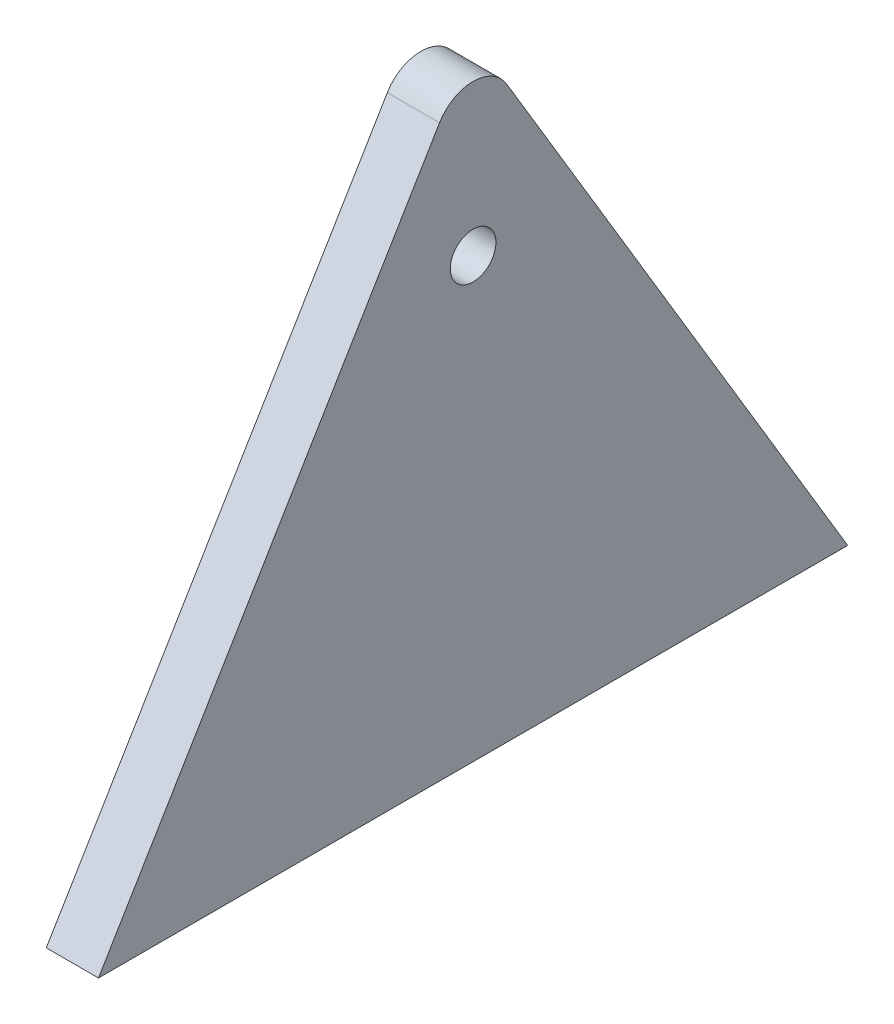
ISO-10303-21;
HEADER;
FILE_DESCRIPTION(('STEP AP214'),'2;1');
FILE_NAME('part.step','',(''),(''),'','','');
FILE_SCHEMA(('AUTOMOTIVE_DESIGN { 1 0 10303 214 1 1 1 1 }'));
ENDSEC;
DATA;
#1=APPLICATION_CONTEXT('core data for automotive mechanical design processes');
#2=APPLICATION_PROTOCOL_DEFINITION('international standard','automotive_design',2000,#1);
#3=PRODUCT_CONTEXT('',#1,'mechanical');
#4=PRODUCT('Part','Part','',(#3));
#5=PRODUCT_RELATED_PRODUCT_CATEGORY('part','',(#4));
#6=PRODUCT_DEFINITION_FORMATION('','',#4);
#7=PRODUCT_DEFINITION_CONTEXT('part definition',#1,'design');
#8=PRODUCT_DEFINITION('design','',#6,#7);
#9=PRODUCT_DEFINITION_SHAPE('','',#8);
#10=(LENGTH_UNIT() NAMED_UNIT(*) SI_UNIT(.MILLI.,.METRE.));
#11=(NAMED_UNIT(*) PLANE_ANGLE_UNIT() SI_UNIT($,.RADIAN.));
#12=(NAMED_UNIT(*) SI_UNIT($,.STERADIAN.) SOLID_ANGLE_UNIT());
#13=UNCERTAINTY_MEASURE_WITH_UNIT(LENGTH_MEASURE(1.E-05),#10,'distance_accuracy_value','');
#14=(GEOMETRIC_REPRESENTATION_CONTEXT(3) GLOBAL_UNCERTAINTY_ASSIGNED_CONTEXT((#13)) GLOBAL_UNIT_ASSIGNED_CONTEXT((#10,
#11,#12)) REPRESENTATION_CONTEXT('',''));
#15=CARTESIAN_POINT('',(0.,0.,0.));
#16=DIRECTION('',(0.,0.,1.));
#17=DIRECTION('',(1.,0.,0.));
#18=AXIS2_PLACEMENT_3D('',#15,#16,#17);
#19=CARTESIAN_POINT('',(12.7,152.4,0.));
#20=DIRECTION('',(0.,-0.513339087994548,0.858185866078512));
#21=DIRECTION('',(0.,-0.858185866078512,-0.513339087994548));
#22=AXIS2_PLACEMENT_3D('',#19,#20,#21);
#23=PLANE('',#22);
#24=DIRECTION('',(0.,0.858185866078512,0.513339087994548));
#25=VECTOR('',#24,1.);
#26=CARTESIAN_POINT('',(0.,152.4,0.));
#27=LINE('',#26,#25);
#28=CARTESIAN_POINT('',(0.,0.,-91.1607614418716));
#29=VERTEX_POINT('',#28);
#30=CARTESIAN_POINT('',(0.,138.734568016387,-8.17422037439783));
#31=VERTEX_POINT('',#30);
#32=EDGE_CURVE('E103',#29,#31,#27,.T.);
#33=ORIENTED_EDGE('',*,*,#32,.T.);
#34=DIRECTION('',(-1.,0.,0.));
#35=VECTOR('',#34,1.);
#36=CARTESIAN_POINT('',(12.7,138.734568016387,-8.17422037439782));
#37=LINE('',#36,#35);
#38=CARTESIAN_POINT('',(12.7,138.734568016387,-8.17422037439783));
#39=VERTEX_POINT('',#38);
#40=EDGE_CURVE('E44',#31,#39,#37,.F.);
#41=ORIENTED_EDGE('',*,*,#40,.T.);
#42=DIRECTION('',(0.,0.858185866078512,0.513339087994548));
#43=VECTOR('',#42,1.);
#44=CARTESIAN_POINT('',(12.7,152.4,0.));
#45=LINE('',#44,#43);
#46=CARTESIAN_POINT('',(12.7,0.,-91.1607614418716));
#47=VERTEX_POINT('',#46);
#48=EDGE_CURVE('E86',#47,#39,#45,.T.);
#49=ORIENTED_EDGE('',*,*,#48,.F.);
#50=DIRECTION('',(-1.,0.,0.));
#51=VECTOR('',#50,1.);
#52=CARTESIAN_POINT('',(12.7,0.,-91.1607614418716));
#53=LINE('',#52,#51);
#54=EDGE_CURVE('E95',#47,#29,#53,.T.);
#55=ORIENTED_EDGE('',*,*,#54,.T.);
#56=EDGE_LOOP('',(#33,#41,#49,#55));
#57=FACE_BOUND('',#56,.T.);
#58=ADVANCED_FACE('F35',(#57),#23,.F.);
#59=CARTESIAN_POINT('',(12.7,152.4,0.));
#60=DIRECTION('',(0.,-0.513339087994548,-0.858185866078512));
#61=DIRECTION('',(0.,0.858185866078512,-0.513339087994548));
#62=AXIS2_PLACEMENT_3D('',#59,#60,#61);
#63=PLANE('',#62);
#64=DIRECTION('',(0.,-0.858185866078512,0.513339087994548));
#65=VECTOR('',#64,1.);
#66=CARTESIAN_POINT('',(12.7,152.4,0.));
#67=LINE('',#66,#65);
#68=CARTESIAN_POINT('',(12.7,138.734568016387,8.17422037439783));
#69=VERTEX_POINT('',#68);
#70=CARTESIAN_POINT('',(12.7,0.,91.1607614418716));
#71=VERTEX_POINT('',#70);
#72=EDGE_CURVE('E76',#69,#71,#67,.T.);
#73=ORIENTED_EDGE('',*,*,#72,.F.);
#74=DIRECTION('',(-1.,0.,0.));
#75=VECTOR('',#74,1.);
#76=CARTESIAN_POINT('',(12.7,138.734568016387,8.17422037439782));
#77=LINE('',#76,#75);
#78=CARTESIAN_POINT('',(0.,138.734568016387,8.17422037439783));
#79=VERTEX_POINT('',#78);
#80=EDGE_CURVE('E94',#69,#79,#77,.T.);
#81=ORIENTED_EDGE('',*,*,#80,.T.);
#82=DIRECTION('',(0.,-0.858185866078512,0.513339087994548));
#83=VECTOR('',#82,1.);
#84=CARTESIAN_POINT('',(0.,152.4,0.));
#85=LINE('',#84,#83);
#86=CARTESIAN_POINT('',(0.,0.,91.1607614418716));
#87=VERTEX_POINT('',#86);
#88=EDGE_CURVE('E91',#79,#87,#85,.T.);
#89=ORIENTED_EDGE('',*,*,#88,.T.);
#90=DIRECTION('',(-1.,0.,0.));
#91=VECTOR('',#90,1.);
#92=CARTESIAN_POINT('',(12.7,0.,91.1607614418716));
#93=LINE('',#92,#91);
#94=EDGE_CURVE('E89',#71,#87,#93,.T.);
#95=ORIENTED_EDGE('',*,*,#94,.F.);
#96=EDGE_LOOP('',(#73,#81,#89,#95));
#97=FACE_BOUND('',#96,.T.);
#98=ADVANCED_FACE('F90',(#97),#63,.F.);
#99=CARTESIAN_POINT('',(12.7,0.,91.1607614418716));
#100=DIRECTION('',(0.,1.,0.));
#101=DIRECTION('',(0.,0.,1.));
#102=AXIS2_PLACEMENT_3D('',#99,#100,#101);
#103=PLANE('',#102);
#104=DIRECTION('',(0.,0.,-1.));
#105=VECTOR('',#104,1.);
#106=CARTESIAN_POINT('',(0.,0.,91.1607614418716));
#107=LINE('',#106,#105);
#108=EDGE_CURVE('E106',#87,#29,#107,.T.);
#109=ORIENTED_EDGE('',*,*,#108,.T.);
#110=ORIENTED_EDGE('',*,*,#54,.F.);
#111=DIRECTION('',(0.,0.,-1.));
#112=VECTOR('',#111,1.);
#113=CARTESIAN_POINT('',(12.7,0.,91.1607614418716));
#114=LINE('',#113,#112);
#115=EDGE_CURVE('E80',#71,#47,#114,.T.);
#116=ORIENTED_EDGE('',*,*,#115,.F.);
#117=ORIENTED_EDGE('',*,*,#94,.T.);
#118=EDGE_LOOP('',(#109,#110,#116,#117));
#119=FACE_BOUND('',#118,.T.);
#120=ADVANCED_FACE('F97',(#119),#103,.F.);
#121=CARTESIAN_POINT('',(12.7,0.,0.));
#122=DIRECTION('',(-1.,0.,0.));
#123=DIRECTION('',(0.,0.,1.));
#124=AXIS2_PLACEMENT_3D('',#121,#122,#123);
#125=PLANE('',#124);
#126=CARTESIAN_POINT('',(12.7,106.68,0.));
#127=DIRECTION('',(1.,0.,0.));
#128=DIRECTION('',(0.,0.,-1.));
#129=AXIS2_PLACEMENT_3D('',#126,#127,#128);
#130=CIRCLE('',#129,5.55625);
#131=CARTESIAN_POINT('',(12.7,106.68,-5.55625));
#132=VERTEX_POINT('',#131);
#133=EDGE_CURVE('E113',#132,#132,#130,.T.);
#134=ORIENTED_EDGE('',*,*,#133,.F.);
#135=EDGE_LOOP('',(#134));
#136=FACE_BOUND('',#135,.T.);
#137=ORIENTED_EDGE('',*,*,#48,.T.);
#138=CARTESIAN_POINT('',(12.7,133.845013203239,0.));
#139=DIRECTION('',(-1.,0.,0.));
#140=DIRECTION('',(0.,0.,1.));
#141=AXIS2_PLACEMENT_3D('',#138,#139,#140);
#142=CIRCLE('',#141,9.525);
#143=EDGE_CURVE('E11',#39,#69,#142,.F.);
#144=ORIENTED_EDGE('',*,*,#143,.T.);
#145=ORIENTED_EDGE('',*,*,#72,.T.);
#146=ORIENTED_EDGE('',*,*,#115,.T.);
#147=EDGE_LOOP('',(#137,#144,#145,#146));
#148=FACE_BOUND('',#147,.T.);
#149=ADVANCED_FACE('F78',(#136,#148),#125,.F.);
#150=CARTESIAN_POINT('',(0.,0.,0.));
#151=DIRECTION('',(-1.,0.,0.));
#152=DIRECTION('',(0.,0.,1.));
#153=AXIS2_PLACEMENT_3D('',#150,#151,#152);
#154=PLANE('',#153);
#155=CARTESIAN_POINT('',(0.,106.68,0.));
#156=DIRECTION('',(-1.,0.,0.));
#157=DIRECTION('',(0.,0.,1.));
#158=AXIS2_PLACEMENT_3D('',#155,#156,#157);
#159=CIRCLE('',#158,5.55625);
#160=CARTESIAN_POINT('',(0.,106.68,-5.55625));
#161=VERTEX_POINT('',#160);
#162=EDGE_CURVE('E39',#161,#161,#159,.T.);
#163=ORIENTED_EDGE('',*,*,#162,.F.);
#164=EDGE_LOOP('',(#163));
#165=FACE_BOUND('',#164,.T.);
#166=ORIENTED_EDGE('',*,*,#88,.F.);
#167=CARTESIAN_POINT('',(0.,133.845013203239,0.));
#168=DIRECTION('',(-1.,0.,0.));
#169=DIRECTION('',(0.,0.,1.));
#170=AXIS2_PLACEMENT_3D('',#167,#168,#169);
#171=CIRCLE('',#170,9.525);
#172=EDGE_CURVE('E58',#79,#31,#171,.T.);
#173=ORIENTED_EDGE('',*,*,#172,.T.);
#174=ORIENTED_EDGE('',*,*,#32,.F.);
#175=ORIENTED_EDGE('',*,*,#108,.F.);
#176=EDGE_LOOP('',(#166,#173,#174,#175));
#177=FACE_BOUND('',#176,.T.);
#178=ADVANCED_FACE('F111',(#165,#177),#154,.T.);
#179=CARTESIAN_POINT('',(12.7,133.845013203239,0.));
#180=DIRECTION('',(-1.,0.,0.));
#181=DIRECTION('',(0.,0.,1.));
#182=AXIS2_PLACEMENT_3D('',#179,#180,#181);
#183=CYLINDRICAL_SURFACE('',#182,9.525);
#184=ORIENTED_EDGE('',*,*,#143,.F.);
#185=ORIENTED_EDGE('',*,*,#40,.F.);
#186=ORIENTED_EDGE('',*,*,#172,.F.);
#187=ORIENTED_EDGE('',*,*,#80,.F.);
#188=EDGE_LOOP('',(#184,#185,#186,#187));
#189=FACE_BOUND('',#188,.T.);
#190=ADVANCED_FACE('F37',(#189),#183,.T.);
#191=CARTESIAN_POINT('',(-1.2E-05,106.68,0.));
#192=DIRECTION('',(1.,0.,0.));
#193=DIRECTION('',(0.,0.,-1.));
#194=AXIS2_PLACEMENT_3D('',#191,#192,#193);
#195=CYLINDRICAL_SURFACE('',#194,5.55625);
#196=CARTESIAN_POINT('',(0.,106.68,-5.55625));
#197=CARTESIAN_POINT('',(0.132291666666667,106.68,-5.55625));
#198=CARTESIAN_POINT('',(0.264583333333333,106.68,-5.55625));
#199=CARTESIAN_POINT('',(0.529166666666666,106.68,-5.55625));
#200=CARTESIAN_POINT('',(0.661458333333333,106.68,-5.55625));
#201=CARTESIAN_POINT('',(0.926041666666666,106.68,-5.55625));
#202=CARTESIAN_POINT('',(1.05833333333333,106.68,-5.55625));
#203=CARTESIAN_POINT('',(1.32291666666667,106.68,-5.55625));
#204=CARTESIAN_POINT('',(1.45520833333333,106.68,-5.55625));
#205=CARTESIAN_POINT('',(1.71979166666667,106.68,-5.55625));
#206=CARTESIAN_POINT('',(1.85208333333333,106.68,-5.55625));
#207=CARTESIAN_POINT('',(2.11666666666667,106.68,-5.55625));
#208=CARTESIAN_POINT('',(2.24895833333333,106.68,-5.55625));
#209=CARTESIAN_POINT('',(2.51354166666667,106.68,-5.55625));
#210=CARTESIAN_POINT('',(2.64583333333333,106.68,-5.55625));
#211=CARTESIAN_POINT('',(2.91041666666667,106.68,-5.55625));
#212=CARTESIAN_POINT('',(3.04270833333333,106.68,-5.55625));
#213=CARTESIAN_POINT('',(3.30729166666667,106.68,-5.55625));
#214=CARTESIAN_POINT('',(3.43958333333333,106.68,-5.55625));
#215=CARTESIAN_POINT('',(3.70416666666667,106.68,-5.55625));
#216=CARTESIAN_POINT('',(3.83645833333333,106.68,-5.55625));
#217=CARTESIAN_POINT('',(4.10104166666667,106.68,-5.55625));
#218=CARTESIAN_POINT('',(4.23333333333333,106.68,-5.55625));
#219=CARTESIAN_POINT('',(4.49791666666667,106.68,-5.55625));
#220=CARTESIAN_POINT('',(4.63020833333333,106.68,-5.55625));
#221=CARTESIAN_POINT('',(4.89479166666667,106.68,-5.55625));
#222=CARTESIAN_POINT('',(5.02708333333333,106.68,-5.55625));
#223=CARTESIAN_POINT('',(5.29166666666667,106.68,-5.55625));
#224=CARTESIAN_POINT('',(5.42395833333333,106.68,-5.55625));
#225=CARTESIAN_POINT('',(5.68854166666667,106.68,-5.55625));
#226=CARTESIAN_POINT('',(5.82083333333333,106.68,-5.55625));
#227=CARTESIAN_POINT('',(6.08541666666667,106.68,-5.55625));
#228=CARTESIAN_POINT('',(6.21770833333333,106.68,-5.55625));
#229=CARTESIAN_POINT('',(6.48229166666667,106.68,-5.55625));
#230=CARTESIAN_POINT('',(6.61458333333333,106.68,-5.55625));
#231=CARTESIAN_POINT('',(6.87916666666667,106.68,-5.55625));
#232=CARTESIAN_POINT('',(7.01145833333333,106.68,-5.55625));
#233=CARTESIAN_POINT('',(7.27604166666667,106.68,-5.55625));
#234=CARTESIAN_POINT('',(7.40833333333333,106.68,-5.55625));
#235=CARTESIAN_POINT('',(7.67291666666667,106.68,-5.55625));
#236=CARTESIAN_POINT('',(7.80520833333333,106.68,-5.55625));
#237=CARTESIAN_POINT('',(8.06979166666666,106.68,-5.55625));
#238=CARTESIAN_POINT('',(8.20208333333333,106.68,-5.55625));
#239=CARTESIAN_POINT('',(8.46666666666666,106.68,-5.55625));
#240=CARTESIAN_POINT('',(8.59895833333333,106.68,-5.55625));
#241=CARTESIAN_POINT('',(8.86354166666666,106.68,-5.55625));
#242=CARTESIAN_POINT('',(8.99583333333333,106.68,-5.55625));
#243=CARTESIAN_POINT('',(9.26041666666666,106.68,-5.55625));
#244=CARTESIAN_POINT('',(9.39270833333333,106.68,-5.55625));
#245=CARTESIAN_POINT('',(9.65729166666666,106.68,-5.55625));
#246=CARTESIAN_POINT('',(9.78958333333333,106.68,-5.55625));
#247=CARTESIAN_POINT('',(10.0541666666667,106.68,-5.55625));
#248=CARTESIAN_POINT('',(10.1864583333333,106.68,-5.55625));
#249=CARTESIAN_POINT('',(10.4510416666667,106.68,-5.55625));
#250=CARTESIAN_POINT('',(10.5833333333333,106.68,-5.55625));
#251=CARTESIAN_POINT('',(10.8479166666667,106.68,-5.55625));
#252=CARTESIAN_POINT('',(10.9802083333333,106.68,-5.55625));
#253=CARTESIAN_POINT('',(11.2447916666667,106.68,-5.55625));
#254=CARTESIAN_POINT('',(11.3770833333333,106.68,-5.55625));
#255=CARTESIAN_POINT('',(11.6416666666667,106.68,-5.55625));
#256=CARTESIAN_POINT('',(11.7739583333333,106.68,-5.55625));
#257=CARTESIAN_POINT('',(12.0385416666667,106.68,-5.55625));
#258=CARTESIAN_POINT('',(12.1708333333333,106.68,-5.55625));
#259=CARTESIAN_POINT('',(12.4354166666667,106.68,-5.55625));
#260=CARTESIAN_POINT('',(12.5677083333333,106.68,-5.55625));
#261=CARTESIAN_POINT('',(12.7,106.68,-5.55625));
#262=B_SPLINE_CURVE_WITH_KNOTS('',3,(#196,#197,#198,#199,#200,#201,#202,#203,#204,#205,#206,
#207,#208,#209,#210,#211,#212,#213,#214,#215,#216,#217,#218,#219,#220,#221,#222,#223,#224,#225,
#226,#227,#228,#229,#230,#231,#232,#233,#234,#235,#236,#237,#238,#239,#240,#241,#242,#243,#244,
#245,#246,#247,#248,#249,#250,#251,#252,#253,#254,#255,#256,#257,#258,#259,#260,#261),
.UNSPECIFIED.,.F.,.F.,(4,2,2,2,2,2,2,2,2,2,2,2,2,2,2,2,2,2,2,2,2,2,2,2,2,2,2,2,2,2,2,2,4),(0.,
0.396875,0.79375,1.190625,1.5875,1.984375,2.38125,2.778125,3.175,3.571875,3.96875,4.365625,
4.7625,5.159375,5.55625,5.953125,6.35,6.746875,7.14375,7.540625,7.9375,8.334375,8.73125,
9.128125,9.525,9.921875,10.31875,10.715625,11.1125,11.509375,11.90625,12.303125,12.7),.UNSPECIFIED.);
#263=EDGE_CURVE('BSEAM120',#161,#132,#262,.T.);
#264=ORIENTED_EDGE('',*,*,#162,.T.);
#265=ORIENTED_EDGE('',*,*,#133,.T.);
#266=ORIENTED_EDGE('',*,*,#263,.T.);
#267=ORIENTED_EDGE('',*,*,#263,.F.);
#268=EDGE_LOOP('',(#264,#266,#265,#267));
#269=FACE_BOUND('',#268,.T.);
#270=ADVANCED_FACE('F120',(#269),#195,.F.);
#271=CLOSED_SHELL('',(#58,#98,#120,#149,#178,#190,#270));
#272=MANIFOLD_SOLID_BREP('B2',#271);
#273=ADVANCED_BREP_SHAPE_REPRESENTATION('',(#18,#272),#14);
#274=SHAPE_DEFINITION_REPRESENTATION(#9,#273);
ENDSEC;
END-ISO-10303-21;
